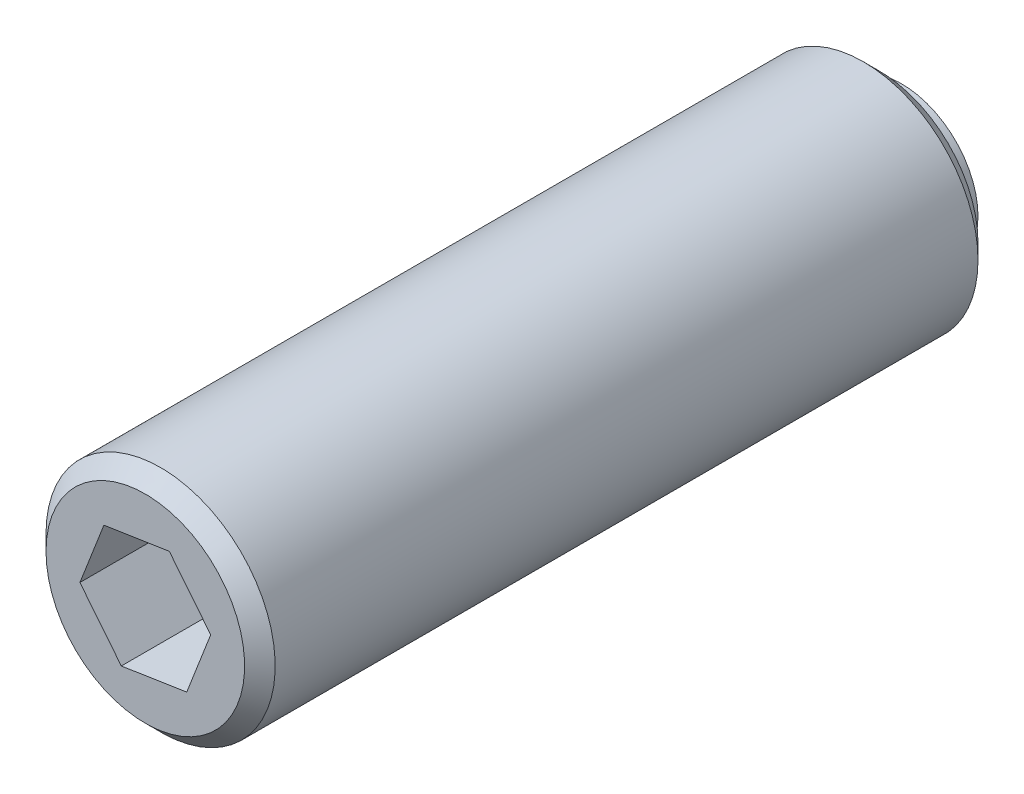
ISO-10303-21;
HEADER;
FILE_DESCRIPTION(('STEP AP214'),'2;1');
FILE_NAME('part.step','',(''),(''),'','','');
FILE_SCHEMA(('AUTOMOTIVE_DESIGN { 1 0 10303 214 1 1 1 1 }'));
ENDSEC;
DATA;
#1=APPLICATION_CONTEXT('core data for automotive mechanical design processes');
#2=APPLICATION_PROTOCOL_DEFINITION('international standard','automotive_design',2000,#1);
#3=PRODUCT_CONTEXT('',#1,'mechanical');
#4=PRODUCT('Part','Part','',(#3));
#5=PRODUCT_RELATED_PRODUCT_CATEGORY('part','',(#4));
#6=PRODUCT_DEFINITION_FORMATION('','',#4);
#7=PRODUCT_DEFINITION_CONTEXT('part definition',#1,'design');
#8=PRODUCT_DEFINITION('design','',#6,#7);
#9=PRODUCT_DEFINITION_SHAPE('','',#8);
#10=(LENGTH_UNIT() NAMED_UNIT(*) SI_UNIT(.MILLI.,.METRE.));
#11=(NAMED_UNIT(*) PLANE_ANGLE_UNIT() SI_UNIT($,.RADIAN.));
#12=(NAMED_UNIT(*) SI_UNIT($,.STERADIAN.) SOLID_ANGLE_UNIT());
#13=UNCERTAINTY_MEASURE_WITH_UNIT(LENGTH_MEASURE(1.E-05),#10,'distance_accuracy_value','');
#14=(GEOMETRIC_REPRESENTATION_CONTEXT(3) GLOBAL_UNCERTAINTY_ASSIGNED_CONTEXT((#13)) GLOBAL_UNIT_ASSIGNED_CONTEXT((#10,
#11,#12)) REPRESENTATION_CONTEXT('',''));
#15=CARTESIAN_POINT('',(0.,0.,0.));
#16=DIRECTION('',(0.,0.,1.));
#17=DIRECTION('',(1.,0.,0.));
#18=AXIS2_PLACEMENT_3D('',#15,#16,#17);
#19=CARTESIAN_POINT('',(-0.903183829567372,1.12587401752654,5.5));
#20=DIRECTION('',(-0.931924497995955,0.362652354238861,0.));
#21=DIRECTION('',(-0.362652354238861,-0.931924497995955,0.));
#22=AXIS2_PLACEMENT_3D('',#19,#20,#21);
#23=PLANE('',#22);
#24=DIRECTION('',(0.,0.,1.));
#25=VECTOR('',#24,1.);
#26=CARTESIAN_POINT('',(-1.42662741542252,-0.21924313192939,5.5));
#27=LINE('',#26,#25);
#28=CARTESIAN_POINT('',(-1.42662741542252,-0.21924313192939,8.));
#29=VERTEX_POINT('',#28);
#30=CARTESIAN_POINT('',(-1.42662741542252,-0.21924313192939,5.5));
#31=VERTEX_POINT('',#30);
#32=EDGE_CURVE('E82',#29,#31,#27,.F.);
#33=ORIENTED_EDGE('',*,*,#32,.T.);
#34=DIRECTION('',(-0.362652354238861,-0.931924497995955,0.));
#35=VECTOR('',#34,1.);
#36=CARTESIAN_POINT('',(-0.903183829567372,1.12587401752654,5.5));
#37=LINE('',#36,#35);
#38=CARTESIAN_POINT('',(-0.903183829567372,1.12587401752654,5.5));
#39=VERTEX_POINT('',#38);
#40=EDGE_CURVE('E71',#39,#31,#37,.T.);
#41=ORIENTED_EDGE('',*,*,#40,.F.);
#42=DIRECTION('',(0.,0.,1.));
#43=VECTOR('',#42,1.);
#44=CARTESIAN_POINT('',(-0.903183829567372,1.12587401752654,5.5));
#45=LINE('',#44,#43);
#46=CARTESIAN_POINT('',(-0.903183829567372,1.12587401752654,8.));
#47=VERTEX_POINT('',#46);
#48=EDGE_CURVE('E91',#39,#47,#45,.T.);
#49=ORIENTED_EDGE('',*,*,#48,.T.);
#50=DIRECTION('',(-0.362652354238861,-0.931924497995955,0.));
#51=VECTOR('',#50,1.);
#52=CARTESIAN_POINT('',(-0.903183829567372,1.12587401752654,8.));
#53=LINE('',#52,#51);
#54=EDGE_CURVE('E66',#29,#47,#53,.F.);
#55=ORIENTED_EDGE('',*,*,#54,.F.);
#56=EDGE_LOOP('',(#33,#41,#49,#55));
#57=FACE_BOUND('',#56,.T.);
#58=ADVANCED_FACE('F16',(#57),#23,.F.);
#59=CARTESIAN_POINT('',(-1.42662741542252,-0.21924313192939,5.5));
#60=DIRECTION('',(-0.780028400511064,-0.625744112554127,0.));
#61=DIRECTION('',(0.625744112554127,-0.780028400511064,0.));
#62=AXIS2_PLACEMENT_3D('',#59,#60,#61);
#63=PLANE('',#62);
#64=DIRECTION('',(0.,0.,1.));
#65=VECTOR('',#64,1.);
#66=CARTESIAN_POINT('',(-0.523443585855143,-1.34511714945593,5.5));
#67=LINE('',#66,#65);
#68=CARTESIAN_POINT('',(-0.523443585855143,-1.34511714945593,8.));
#69=VERTEX_POINT('',#68);
#70=CARTESIAN_POINT('',(-0.523443585855143,-1.34511714945593,5.5));
#71=VERTEX_POINT('',#70);
#72=EDGE_CURVE('E87',#69,#71,#67,.F.);
#73=ORIENTED_EDGE('',*,*,#72,.T.);
#74=DIRECTION('',(0.625744112554127,-0.780028400511064,0.));
#75=VECTOR('',#74,1.);
#76=CARTESIAN_POINT('',(-1.42662741542252,-0.21924313192939,5.5));
#77=LINE('',#76,#75);
#78=EDGE_CURVE('E75',#31,#71,#77,.T.);
#79=ORIENTED_EDGE('',*,*,#78,.F.);
#80=ORIENTED_EDGE('',*,*,#32,.F.);
#81=DIRECTION('',(0.625744112554127,-0.780028400511064,0.));
#82=VECTOR('',#81,1.);
#83=CARTESIAN_POINT('',(-1.42662741542252,-0.21924313192939,8.));
#84=LINE('',#83,#82);
#85=EDGE_CURVE('E89',#69,#29,#84,.F.);
#86=ORIENTED_EDGE('',*,*,#85,.F.);
#87=EDGE_LOOP('',(#73,#79,#80,#86));
#88=FACE_BOUND('',#87,.T.);
#89=ADVANCED_FACE('F85',(#88),#63,.F.);
#90=CARTESIAN_POINT('',(0.523443585855142,1.34511714945592,5.5));
#91=DIRECTION('',(-0.151896097484891,0.988396466792987,0.));
#92=DIRECTION('',(-0.988396466792987,-0.151896097484891,0.));
#93=AXIS2_PLACEMENT_3D('',#90,#91,#92);
#94=PLANE('',#93);
#95=ORIENTED_EDGE('',*,*,#48,.F.);
#96=DIRECTION('',(0.988396466792987,0.151896097484891,0.));
#97=VECTOR('',#96,1.);
#98=CARTESIAN_POINT('',(-0.903183829567372,1.12587401752654,5.5));
#99=LINE('',#98,#97);
#100=CARTESIAN_POINT('',(0.523443585855142,1.34511714945592,5.5));
#101=VERTEX_POINT('',#100);
#102=EDGE_CURVE('E78',#39,#101,#99,.T.);
#103=ORIENTED_EDGE('',*,*,#102,.T.);
#104=DIRECTION('',(0.,0.,1.));
#105=VECTOR('',#104,1.);
#106=CARTESIAN_POINT('',(0.523443585855142,1.34511714945593,5.5));
#107=LINE('',#106,#105);
#108=CARTESIAN_POINT('',(0.523443585855142,1.34511714945592,8.));
#109=VERTEX_POINT('',#108);
#110=EDGE_CURVE('E119',#101,#109,#107,.T.);
#111=ORIENTED_EDGE('',*,*,#110,.T.);
#112=DIRECTION('',(-0.988396466792987,-0.151896097484891,0.));
#113=VECTOR('',#112,1.);
#114=CARTESIAN_POINT('',(0.523443585855142,1.34511714945592,8.));
#115=LINE('',#114,#113);
#116=EDGE_CURVE('E130',#47,#109,#115,.F.);
#117=ORIENTED_EDGE('',*,*,#116,.F.);
#118=EDGE_LOOP('',(#95,#103,#111,#117));
#119=FACE_BOUND('',#118,.T.);
#120=ADVANCED_FACE('F133',(#119),#94,.F.);
#121=CARTESIAN_POINT('',(-0.523443585855143,-1.34511714945593,5.5));
#122=DIRECTION('',(0.151896097484892,-0.988396466792987,0.));
#123=DIRECTION('',(0.988396466792987,0.151896097484892,0.));
#124=AXIS2_PLACEMENT_3D('',#121,#122,#123);
#125=PLANE('',#124);
#126=DIRECTION('',(0.,0.,1.));
#127=VECTOR('',#126,1.);
#128=CARTESIAN_POINT('',(0.903183829567371,-1.12587401752654,5.5));
#129=LINE('',#128,#127);
#130=CARTESIAN_POINT('',(0.903183829567371,-1.12587401752654,8.));
#131=VERTEX_POINT('',#130);
#132=CARTESIAN_POINT('',(0.903183829567371,-1.12587401752654,5.5));
#133=VERTEX_POINT('',#132);
#134=EDGE_CURVE('E116',#131,#133,#129,.F.);
#135=ORIENTED_EDGE('',*,*,#134,.T.);
#136=DIRECTION('',(-0.988396466792987,-0.151896097484892,0.));
#137=VECTOR('',#136,1.);
#138=CARTESIAN_POINT('',(0.903183829567371,-1.12587401752654,5.5));
#139=LINE('',#138,#137);
#140=EDGE_CURVE('E124',#133,#71,#139,.T.);
#141=ORIENTED_EDGE('',*,*,#140,.T.);
#142=ORIENTED_EDGE('',*,*,#72,.F.);
#143=DIRECTION('',(0.988396466792987,0.151896097484892,0.));
#144=VECTOR('',#143,1.);
#145=CARTESIAN_POINT('',(-0.523443585855143,-1.34511714945593,8.));
#146=LINE('',#145,#144);
#147=EDGE_CURVE('E127',#131,#69,#146,.F.);
#148=ORIENTED_EDGE('',*,*,#147,.F.);
#149=EDGE_LOOP('',(#135,#141,#142,#148));
#150=FACE_BOUND('',#149,.T.);
#151=ADVANCED_FACE('F138',(#150),#125,.F.);
#152=CARTESIAN_POINT('',(-0.523443585855144,-1.34511714945593,5.5));
#153=DIRECTION('',(0.,0.,-1.));
#154=DIRECTION('',(-1.,0.,0.));
#155=AXIS2_PLACEMENT_3D('',#152,#153,#154);
#156=PLANE('',#155);
#157=DIRECTION('',(0.36265235423886,0.931924497995955,0.));
#158=VECTOR('',#157,1.);
#159=CARTESIAN_POINT('',(0.903183829567371,-1.12587401752654,5.5));
#160=LINE('',#159,#158);
#161=CARTESIAN_POINT('',(1.42662741542251,0.219243131929385,5.5));
#162=VERTEX_POINT('',#161);
#163=EDGE_CURVE('E114',#133,#162,#160,.T.);
#164=ORIENTED_EDGE('',*,*,#163,.T.);
#165=DIRECTION('',(-0.625744112554127,0.780028400511064,0.));
#166=VECTOR('',#165,1.);
#167=CARTESIAN_POINT('',(1.42662741542251,0.219243131929385,5.5));
#168=LINE('',#167,#166);
#169=EDGE_CURVE('E122',#162,#101,#168,.T.);
#170=ORIENTED_EDGE('',*,*,#169,.T.);
#171=ORIENTED_EDGE('',*,*,#102,.F.);
#172=ORIENTED_EDGE('',*,*,#40,.T.);
#173=ORIENTED_EDGE('',*,*,#78,.T.);
#174=ORIENTED_EDGE('',*,*,#140,.F.);
#175=EDGE_LOOP('',(#164,#170,#171,#172,#173,#174));
#176=FACE_BOUND('',#175,.T.);
#177=ADVANCED_FACE('F72',(#176),#156,.F.);
#178=CARTESIAN_POINT('',(1.42662741542251,0.219243131929385,5.5));
#179=DIRECTION('',(0.780028400511064,0.625744112554127,0.));
#180=DIRECTION('',(-0.625744112554127,0.780028400511064,0.));
#181=AXIS2_PLACEMENT_3D('',#178,#179,#180);
#182=PLANE('',#181);
#183=ORIENTED_EDGE('',*,*,#110,.F.);
#184=ORIENTED_EDGE('',*,*,#169,.F.);
#185=DIRECTION('',(0.,0.,1.));
#186=VECTOR('',#185,1.);
#187=CARTESIAN_POINT('',(1.42662741542251,0.219243131929385,5.5));
#188=LINE('',#187,#186);
#189=CARTESIAN_POINT('',(1.42662741542251,0.219243131929385,8.));
#190=VERTEX_POINT('',#189);
#191=EDGE_CURVE('E110',#162,#190,#188,.T.);
#192=ORIENTED_EDGE('',*,*,#191,.T.);
#193=DIRECTION('',(-0.625744112554127,0.780028400511064,0.));
#194=VECTOR('',#193,1.);
#195=CARTESIAN_POINT('',(1.42662741542251,0.219243131929385,8.));
#196=LINE('',#195,#194);
#197=EDGE_CURVE('E34',#109,#190,#196,.F.);
#198=ORIENTED_EDGE('',*,*,#197,.F.);
#199=EDGE_LOOP('',(#183,#184,#192,#198));
#200=FACE_BOUND('',#199,.T.);
#201=ADVANCED_FACE('F145',(#200),#182,.F.);
#202=CARTESIAN_POINT('',(0.,0.,-8.5));
#203=DIRECTION('',(0.,0.,-1.));
#204=DIRECTION('',(-1.,0.,0.));
#205=AXIS2_PLACEMENT_3D('',#202,#203,#204);
#206=PLANE('',#205);
#207=CARTESIAN_POINT('',(0.,0.,-8.5));
#208=DIRECTION('',(0.,0.,1.));
#209=DIRECTION('',(1.,0.,0.));
#210=AXIS2_PLACEMENT_3D('',#207,#208,#209);
#211=CIRCLE('',#210,1.66666666666667);
#212=CARTESIAN_POINT('',(1.66666666666667,0.,-8.5));
#213=VERTEX_POINT('',#212);
#214=EDGE_CURVE('E19',#213,#213,#211,.T.);
#215=ORIENTED_EDGE('',*,*,#214,.F.);
#216=EDGE_LOOP('',(#215));
#217=FACE_BOUND('',#216,.T.);
#218=ADVANCED_FACE('F147',(#217),#206,.T.);
#219=CARTESIAN_POINT('',(0.903183829567371,-1.12587401752654,5.5));
#220=DIRECTION('',(0.931924497995955,-0.36265235423886,0.));
#221=DIRECTION('',(0.36265235423886,0.931924497995955,0.));
#222=AXIS2_PLACEMENT_3D('',#219,#220,#221);
#223=PLANE('',#222);
#224=ORIENTED_EDGE('',*,*,#191,.F.);
#225=ORIENTED_EDGE('',*,*,#163,.F.);
#226=ORIENTED_EDGE('',*,*,#134,.F.);
#227=DIRECTION('',(-0.36265235423886,-0.931924497995955,0.));
#228=VECTOR('',#227,1.);
#229=CARTESIAN_POINT('',(1.42662741542251,0.219243131929385,8.));
#230=LINE('',#229,#228);
#231=EDGE_CURVE('E103',#190,#131,#230,.T.);
#232=ORIENTED_EDGE('',*,*,#231,.F.);
#233=EDGE_LOOP('',(#224,#225,#226,#232));
#234=FACE_BOUND('',#233,.T.);
#235=ADVANCED_FACE('F143',(#234),#223,.F.);
#236=CARTESIAN_POINT('',(0.,0.,-8.5));
#237=DIRECTION('',(0.,0.,1.));
#238=DIRECTION('',(1.,0.,0.));
#239=AXIS2_PLACEMENT_3D('',#236,#237,#238);
#240=CYLINDRICAL_SURFACE('',#239,1.66666666666667);
#241=ORIENTED_EDGE('',*,*,#214,.T.);
#242=EDGE_LOOP('',(#241));
#243=FACE_BOUND('',#242,.T.);
#244=CARTESIAN_POINT('',(0.,0.,-8.));
#245=DIRECTION('',(0.,0.,1.));
#246=DIRECTION('',(1.,0.,0.));
#247=AXIS2_PLACEMENT_3D('',#244,#245,#246);
#248=CIRCLE('',#247,1.66666666666667);
#249=CARTESIAN_POINT('',(1.66666666666667,0.,-8.));
#250=VERTEX_POINT('',#249);
#251=EDGE_CURVE('E101',#250,#250,#248,.F.);
#252=ORIENTED_EDGE('',*,*,#251,.T.);
#253=EDGE_LOOP('',(#252));
#254=FACE_BOUND('',#253,.T.);
#255=ADVANCED_FACE('F179',(#243,#254),#240,.T.);
#256=CARTESIAN_POINT('',(0.,0.,8.));
#257=DIRECTION('',(0.,0.,1.));
#258=DIRECTION('',(1.,0.,0.));
#259=AXIS2_PLACEMENT_3D('',#256,#257,#258);
#260=PLANE('',#259);
#261=CARTESIAN_POINT('',(0.,0.,7.99999999998136));
#262=DIRECTION('',(0.,0.,-1.));
#263=DIRECTION('',(-1.,0.,0.));
#264=AXIS2_PLACEMENT_3D('',#261,#262,#263);
#265=CIRCLE('',#264,2.16666666671017);
#266=CARTESIAN_POINT('',(-2.16666666671017,0.,7.99999999998136));
#267=VERTEX_POINT('',#266);
#268=EDGE_CURVE('E99',#267,#267,#265,.T.);
#269=ORIENTED_EDGE('',*,*,#268,.F.);
#270=EDGE_LOOP('',(#269));
#271=FACE_BOUND('',#270,.T.);
#272=ORIENTED_EDGE('',*,*,#197,.T.);
#273=ORIENTED_EDGE('',*,*,#231,.T.);
#274=ORIENTED_EDGE('',*,*,#147,.T.);
#275=ORIENTED_EDGE('',*,*,#85,.T.);
#276=ORIENTED_EDGE('',*,*,#54,.T.);
#277=ORIENTED_EDGE('',*,*,#116,.T.);
#278=EDGE_LOOP('',(#272,#273,#274,#275,#276,#277));
#279=FACE_BOUND('',#278,.T.);
#280=ADVANCED_FACE('F135',(#271,#279),#260,.T.);
#281=CARTESIAN_POINT('',(0.,0.,-8.));
#282=DIRECTION('',(0.,0.,1.));
#283=DIRECTION('',(1.,0.,0.));
#284=AXIS2_PLACEMENT_3D('',#281,#282,#283);
#285=PLANE('',#284);
#286=ORIENTED_EDGE('',*,*,#251,.F.);
#287=EDGE_LOOP('',(#286));
#288=FACE_BOUND('',#287,.T.);
#289=CARTESIAN_POINT('',(0.,0.,-8.0000000000382));
#290=DIRECTION('',(0.,0.,1.));
#291=DIRECTION('',(1.,0.,0.));
#292=AXIS2_PLACEMENT_3D('',#289,#290,#291);
#293=CIRCLE('',#292,2.16666666665333);
#294=CARTESIAN_POINT('',(2.16666666665333,0.,-8.0000000000382));
#295=VERTEX_POINT('',#294);
#296=EDGE_CURVE('E96',#295,#295,#293,.T.);
#297=ORIENTED_EDGE('',*,*,#296,.F.);
#298=EDGE_LOOP('',(#297));
#299=FACE_BOUND('',#298,.T.);
#300=ADVANCED_FACE('F172',(#288,#299),#285,.F.);
#301=CARTESIAN_POINT('',(0.,0.,7.66666666663696));
#302=DIRECTION('',(0.,0.,-1.));
#303=DIRECTION('',(-1.,0.,0.));
#304=AXIS2_PLACEMENT_3D('',#301,#302,#303);
#305=CONICAL_SURFACE('',#304,2.50000000005457,0.785398163397448);
#306=CARTESIAN_POINT('',(0.,0.,7.66666666666666));
#307=DIRECTION('',(0.,0.,-1.));
#308=DIRECTION('',(-1.,0.,0.));
#309=AXIS2_PLACEMENT_3D('',#306,#307,#308);
#310=CIRCLE('',#309,2.5);
#311=CARTESIAN_POINT('',(-2.5,0.,7.66666666666666));
#312=VERTEX_POINT('',#311);
#313=EDGE_CURVE('E25',#312,#312,#310,.T.);
#314=ORIENTED_EDGE('',*,*,#313,.F.);
#315=EDGE_LOOP('',(#314));
#316=FACE_BOUND('',#315,.T.);
#317=ORIENTED_EDGE('',*,*,#268,.T.);
#318=EDGE_LOOP('',(#317));
#319=FACE_BOUND('',#318,.T.);
#320=ADVANCED_FACE('F165',(#316,#319),#305,.T.);
#321=CARTESIAN_POINT('',(0.,0.,-7.66666666663696));
#322=DIRECTION('',(0.,0.,1.));
#323=DIRECTION('',(1.,0.,0.));
#324=AXIS2_PLACEMENT_3D('',#321,#322,#323);
#325=CONICAL_SURFACE('',#324,2.50000000005457,0.785398163397448);
#326=CARTESIAN_POINT('',(0.,0.,-7.66666666666666));
#327=DIRECTION('',(0.,0.,-1.));
#328=DIRECTION('',(-1.,0.,0.));
#329=AXIS2_PLACEMENT_3D('',#326,#327,#328);
#330=CIRCLE('',#329,2.5);
#331=CARTESIAN_POINT('',(-2.5,0.,-7.66666666666666));
#332=VERTEX_POINT('',#331);
#333=EDGE_CURVE('E11',#332,#332,#330,.F.);
#334=ORIENTED_EDGE('',*,*,#333,.F.);
#335=EDGE_LOOP('',(#334));
#336=FACE_BOUND('',#335,.T.);
#337=ORIENTED_EDGE('',*,*,#296,.T.);
#338=EDGE_LOOP('',(#337));
#339=FACE_BOUND('',#338,.T.);
#340=ADVANCED_FACE('F159',(#336,#339),#325,.T.);
#341=CARTESIAN_POINT('',(0.,0.,8.));
#342=DIRECTION('',(0.,0.,-1.));
#343=DIRECTION('',(-1.,0.,0.));
#344=AXIS2_PLACEMENT_3D('',#341,#342,#343);
#345=CYLINDRICAL_SURFACE('',#344,2.5);
#346=ORIENTED_EDGE('',*,*,#333,.T.);
#347=EDGE_LOOP('',(#346));
#348=FACE_BOUND('',#347,.T.);
#349=ORIENTED_EDGE('',*,*,#313,.T.);
#350=EDGE_LOOP('',(#349));
#351=FACE_BOUND('',#350,.T.);
#352=ADVANCED_FACE('F157',(#348,#351),#345,.T.);
#353=CLOSED_SHELL('',(#58,#89,#120,#151,#177,#201,#218,#235,#255,#280,#300,#320,#340,#352));
#354=MANIFOLD_SOLID_BREP('B1',#353);
#355=ADVANCED_BREP_SHAPE_REPRESENTATION('',(#18,#354),#14);
#356=SHAPE_DEFINITION_REPRESENTATION(#9,#355);
ENDSEC;
END-ISO-10303-21;
